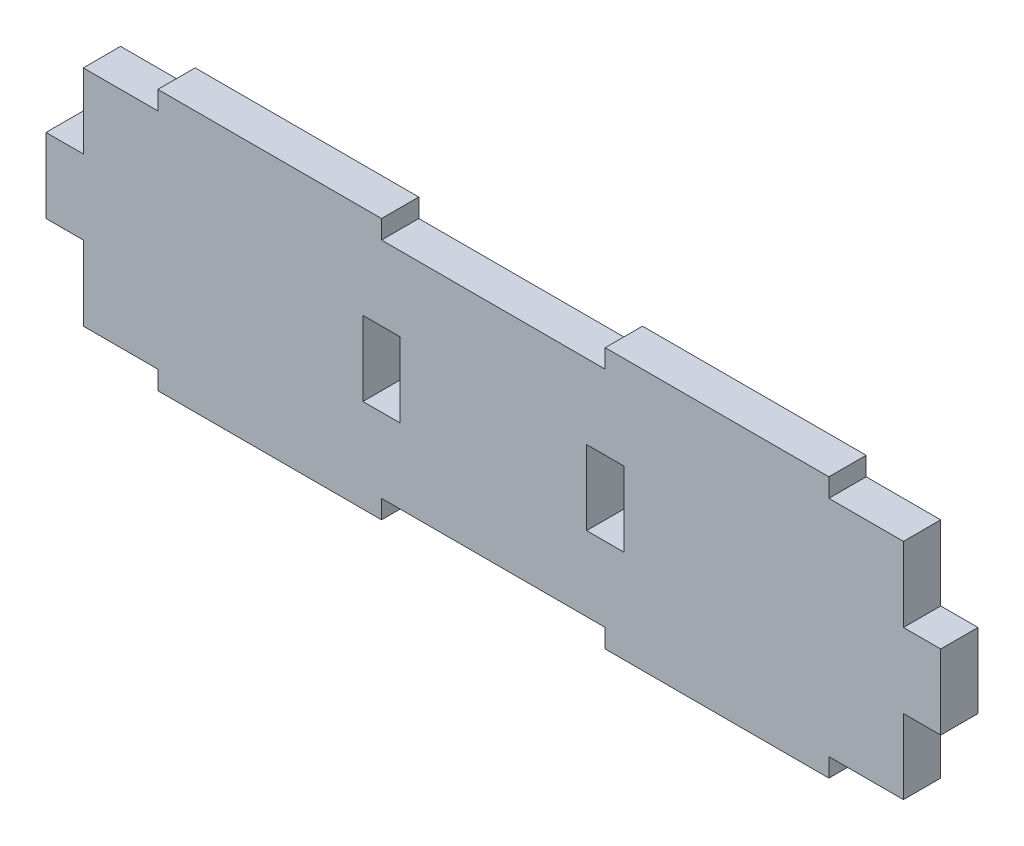
ISO-10303-21;
HEADER;
FILE_DESCRIPTION(('STEP AP214'),'2;1');
FILE_NAME('part.step','',(''),(''),'','','');
FILE_SCHEMA(('AUTOMOTIVE_DESIGN { 1 0 10303 214 1 1 1 1 }'));
ENDSEC;
DATA;
#1=APPLICATION_CONTEXT('core data for automotive mechanical design processes');
#2=APPLICATION_PROTOCOL_DEFINITION('international standard','automotive_design',2000,#1);
#3=PRODUCT_CONTEXT('',#1,'mechanical');
#4=PRODUCT('Part','Part','',(#3));
#5=PRODUCT_RELATED_PRODUCT_CATEGORY('part','',(#4));
#6=PRODUCT_DEFINITION_FORMATION('','',#4);
#7=PRODUCT_DEFINITION_CONTEXT('part definition',#1,'design');
#8=PRODUCT_DEFINITION('design','',#6,#7);
#9=PRODUCT_DEFINITION_SHAPE('','',#8);
#10=(LENGTH_UNIT() NAMED_UNIT(*) SI_UNIT(.MILLI.,.METRE.));
#11=(NAMED_UNIT(*) PLANE_ANGLE_UNIT() SI_UNIT($,.RADIAN.));
#12=(NAMED_UNIT(*) SI_UNIT($,.STERADIAN.) SOLID_ANGLE_UNIT());
#13=UNCERTAINTY_MEASURE_WITH_UNIT(LENGTH_MEASURE(1.E-05),#10,'distance_accuracy_value','');
#14=(GEOMETRIC_REPRESENTATION_CONTEXT(3) GLOBAL_UNCERTAINTY_ASSIGNED_CONTEXT((#13)) GLOBAL_UNIT_ASSIGNED_CONTEXT((#10,
#11,#12)) REPRESENTATION_CONTEXT('',''));
#15=CARTESIAN_POINT('',(0.,0.,0.));
#16=DIRECTION('',(0.,0.,1.));
#17=DIRECTION('',(1.,0.,0.));
#18=AXIS2_PLACEMENT_3D('',#15,#16,#17);
#19=CARTESIAN_POINT('',(0.,38.1,12.7));
#20=DIRECTION('',(0.,1.,0.));
#21=DIRECTION('',(0.,0.,1.));
#22=AXIS2_PLACEMENT_3D('',#19,#20,#21);
#23=PLANE('',#22);
#24=DIRECTION('',(0.,0.,1.));
#25=VECTOR('',#24,1.);
#26=CARTESIAN_POINT('',(-38.1,38.1,0.));
#27=LINE('',#26,#25);
#28=CARTESIAN_POINT('',(-38.1,38.1,0.));
#29=VERTEX_POINT('',#28);
#30=CARTESIAN_POINT('',(-38.1,38.1,12.7));
#31=VERTEX_POINT('',#30);
#32=EDGE_CURVE('E495',#29,#31,#27,.T.);
#33=ORIENTED_EDGE('',*,*,#32,.T.);
#34=DIRECTION('',(1.,0.,0.));
#35=VECTOR('',#34,1.);
#36=CARTESIAN_POINT('',(0.,38.1,12.7));
#37=LINE('',#36,#35);
#38=CARTESIAN_POINT('',(38.1,38.1,12.7));
#39=VERTEX_POINT('',#38);
#40=EDGE_CURVE('E631',#31,#39,#37,.T.);
#41=ORIENTED_EDGE('',*,*,#40,.T.);
#42=DIRECTION('',(0.,0.,1.));
#43=VECTOR('',#42,1.);
#44=CARTESIAN_POINT('',(38.1,38.1,0.));
#45=LINE('',#44,#43);
#46=CARTESIAN_POINT('',(38.1,38.1,0.));
#47=VERTEX_POINT('',#46);
#48=EDGE_CURVE('E533',#47,#39,#45,.T.);
#49=ORIENTED_EDGE('',*,*,#48,.F.);
#50=DIRECTION('',(1.,0.,0.));
#51=VECTOR('',#50,1.);
#52=CARTESIAN_POINT('',(0.,38.1,0.));
#53=LINE('',#52,#51);
#54=EDGE_CURVE('E643',#29,#47,#53,.T.);
#55=ORIENTED_EDGE('',*,*,#54,.F.);
#56=EDGE_LOOP('',(#33,#41,#49,#55));
#57=FACE_BOUND('',#56,.T.);
#58=ADVANCED_FACE('F41',(#57),#23,.T.);
#59=DIRECTION('',(0.,0.,1.));
#60=VECTOR('',#59,1.);
#61=CARTESIAN_POINT('',(139.7,38.1,0.));
#62=LINE('',#61,#60);
#63=CARTESIAN_POINT('',(139.7,38.1,0.));
#64=VERTEX_POINT('',#63);
#65=CARTESIAN_POINT('',(139.7,38.1,12.7));
#66=VERTEX_POINT('',#65);
#67=EDGE_CURVE('E432',#64,#66,#62,.T.);
#68=ORIENTED_EDGE('',*,*,#67,.F.);
#69=CARTESIAN_POINT('',(114.3,38.1,0.));
#70=VERTEX_POINT('',#69);
#71=EDGE_CURVE('E640',#70,#64,#53,.T.);
#72=ORIENTED_EDGE('',*,*,#71,.F.);
#73=DIRECTION('',(0.,0.,1.));
#74=VECTOR('',#73,1.);
#75=CARTESIAN_POINT('',(114.3,38.1,0.));
#76=LINE('',#75,#74);
#77=CARTESIAN_POINT('',(114.3,38.1,12.7));
#78=VERTEX_POINT('',#77);
#79=EDGE_CURVE('E522',#70,#78,#76,.T.);
#80=ORIENTED_EDGE('',*,*,#79,.T.);
#81=EDGE_CURVE('E629',#78,#66,#37,.T.);
#82=ORIENTED_EDGE('',*,*,#81,.T.);
#83=EDGE_LOOP('',(#68,#72,#80,#82));
#84=FACE_BOUND('',#83,.T.);
#85=ADVANCED_FACE('F656',(#84),#23,.T.);
#86=CARTESIAN_POINT('',(0.,-38.1,12.7));
#87=DIRECTION('',(0.,1.,0.));
#88=DIRECTION('',(0.,0.,1.));
#89=AXIS2_PLACEMENT_3D('',#86,#87,#88);
#90=PLANE('',#89);
#91=DIRECTION('',(1.,0.,0.));
#92=VECTOR('',#91,1.);
#93=CARTESIAN_POINT('',(0.,-38.1,0.));
#94=LINE('',#93,#92);
#95=CARTESIAN_POINT('',(-38.1,-38.1,0.));
#96=VERTEX_POINT('',#95);
#97=CARTESIAN_POINT('',(38.1,-38.1,0.));
#98=VERTEX_POINT('',#97);
#99=EDGE_CURVE('E637',#96,#98,#94,.T.);
#100=ORIENTED_EDGE('',*,*,#99,.T.);
#101=DIRECTION('',(0.,0.,1.));
#102=VECTOR('',#101,1.);
#103=CARTESIAN_POINT('',(38.1,-38.1,0.));
#104=LINE('',#103,#102);
#105=CARTESIAN_POINT('',(38.1,-38.1,12.7));
#106=VERTEX_POINT('',#105);
#107=EDGE_CURVE('E571',#98,#106,#104,.T.);
#108=ORIENTED_EDGE('',*,*,#107,.T.);
#109=DIRECTION('',(1.,0.,0.));
#110=VECTOR('',#109,1.);
#111=CARTESIAN_POINT('',(0.,-38.1,12.7));
#112=LINE('',#111,#110);
#113=CARTESIAN_POINT('',(-38.1,-38.1,12.7));
#114=VERTEX_POINT('',#113);
#115=EDGE_CURVE('E624',#114,#106,#112,.T.);
#116=ORIENTED_EDGE('',*,*,#115,.F.);
#117=DIRECTION('',(0.,0.,1.));
#118=VECTOR('',#117,1.);
#119=CARTESIAN_POINT('',(-38.1,-38.1,0.));
#120=LINE('',#119,#118);
#121=EDGE_CURVE('E596',#96,#114,#120,.T.);
#122=ORIENTED_EDGE('',*,*,#121,.F.);
#123=EDGE_LOOP('',(#100,#108,#116,#122));
#124=FACE_BOUND('',#123,.T.);
#125=ADVANCED_FACE('F709',(#124),#90,.F.);
#126=CARTESIAN_POINT('',(114.3,-38.1,0.));
#127=VERTEX_POINT('',#126);
#128=CARTESIAN_POINT('',(139.7,-38.1,0.));
#129=VERTEX_POINT('',#128);
#130=EDGE_CURVE('E610',#127,#129,#94,.T.);
#131=ORIENTED_EDGE('',*,*,#130,.T.);
#132=DIRECTION('',(0.,0.,1.));
#133=VECTOR('',#132,1.);
#134=CARTESIAN_POINT('',(139.7,-38.1,0.));
#135=LINE('',#134,#133);
#136=CARTESIAN_POINT('',(139.7,-38.1,12.7));
#137=VERTEX_POINT('',#136);
#138=EDGE_CURVE('E345',#129,#137,#135,.T.);
#139=ORIENTED_EDGE('',*,*,#138,.T.);
#140=CARTESIAN_POINT('',(114.3,-38.1,12.7));
#141=VERTEX_POINT('',#140);
#142=EDGE_CURVE('E625',#141,#137,#112,.T.);
#143=ORIENTED_EDGE('',*,*,#142,.F.);
#144=DIRECTION('',(0.,0.,1.));
#145=VECTOR('',#144,1.);
#146=CARTESIAN_POINT('',(114.3,-38.1,0.));
#147=LINE('',#146,#145);
#148=EDGE_CURVE('E575',#127,#141,#147,.T.);
#149=ORIENTED_EDGE('',*,*,#148,.F.);
#150=EDGE_LOOP('',(#131,#139,#143,#149));
#151=FACE_BOUND('',#150,.T.);
#152=ADVANCED_FACE('F684',(#151),#90,.F.);
#153=CARTESIAN_POINT('',(-139.7,-38.1,12.7));
#154=VERTEX_POINT('',#153);
#155=CARTESIAN_POINT('',(-114.3,-38.1,12.7));
#156=VERTEX_POINT('',#155);
#157=EDGE_CURVE('E620',#154,#156,#112,.T.);
#158=ORIENTED_EDGE('',*,*,#157,.F.);
#159=DIRECTION('',(0.,0.,1.));
#160=VECTOR('',#159,1.);
#161=CARTESIAN_POINT('',(-139.7,-38.1,0.));
#162=LINE('',#161,#160);
#163=CARTESIAN_POINT('',(-139.7,-38.1,0.));
#164=VERTEX_POINT('',#163);
#165=EDGE_CURVE('E455',#164,#154,#162,.T.);
#166=ORIENTED_EDGE('',*,*,#165,.F.);
#167=CARTESIAN_POINT('',(-114.3,-38.1,0.));
#168=VERTEX_POINT('',#167);
#169=EDGE_CURVE('E633',#164,#168,#94,.T.);
#170=ORIENTED_EDGE('',*,*,#169,.T.);
#171=DIRECTION('',(0.,0.,1.));
#172=VECTOR('',#171,1.);
#173=CARTESIAN_POINT('',(-114.3,-38.1,0.));
#174=LINE('',#173,#172);
#175=EDGE_CURVE('E614',#168,#156,#174,.T.);
#176=ORIENTED_EDGE('',*,*,#175,.T.);
#177=EDGE_LOOP('',(#158,#166,#170,#176));
#178=FACE_BOUND('',#177,.T.);
#179=ADVANCED_FACE('F43',(#178),#90,.F.);
#180=CARTESIAN_POINT('',(152.4,0.,12.7));
#181=DIRECTION('',(-1.,0.,0.));
#182=DIRECTION('',(0.,0.,1.));
#183=AXIS2_PLACEMENT_3D('',#180,#181,#182);
#184=PLANE('',#183);
#185=DIRECTION('',(0.,1.,0.));
#186=VECTOR('',#185,1.);
#187=CARTESIAN_POINT('',(152.4,0.,12.7));
#188=LINE('',#187,#186);
#189=CARTESIAN_POINT('',(152.4,-12.7,12.7));
#190=VERTEX_POINT('',#189);
#191=CARTESIAN_POINT('',(152.4,12.7,12.7));
#192=VERTEX_POINT('',#191);
#193=EDGE_CURVE('E623',#190,#192,#188,.T.);
#194=ORIENTED_EDGE('',*,*,#193,.F.);
#195=DIRECTION('',(0.,0.,1.));
#196=VECTOR('',#195,1.);
#197=CARTESIAN_POINT('',(152.4,-12.7,0.));
#198=LINE('',#197,#196);
#199=CARTESIAN_POINT('',(152.4,-12.7,0.));
#200=VERTEX_POINT('',#199);
#201=EDGE_CURVE('E337',#200,#190,#198,.T.);
#202=ORIENTED_EDGE('',*,*,#201,.F.);
#203=DIRECTION('',(0.,1.,0.));
#204=VECTOR('',#203,1.);
#205=CARTESIAN_POINT('',(152.4,0.,0.));
#206=LINE('',#205,#204);
#207=CARTESIAN_POINT('',(152.4,12.7,0.));
#208=VERTEX_POINT('',#207);
#209=EDGE_CURVE('E636',#200,#208,#206,.T.);
#210=ORIENTED_EDGE('',*,*,#209,.T.);
#211=DIRECTION('',(0.,0.,1.));
#212=VECTOR('',#211,1.);
#213=CARTESIAN_POINT('',(152.4,12.7,0.));
#214=LINE('',#213,#212);
#215=EDGE_CURVE('E410',#208,#192,#214,.T.);
#216=ORIENTED_EDGE('',*,*,#215,.T.);
#217=EDGE_LOOP('',(#194,#202,#210,#216));
#218=FACE_BOUND('',#217,.T.);
#219=ADVANCED_FACE('F673',(#218),#184,.F.);
#220=DIRECTION('',(0.,0.,1.));
#221=VECTOR('',#220,1.);
#222=CARTESIAN_POINT('',(-139.7,38.1,0.));
#223=LINE('',#222,#221);
#224=CARTESIAN_POINT('',(-139.7,38.1,0.));
#225=VERTEX_POINT('',#224);
#226=CARTESIAN_POINT('',(-139.7,38.1,12.7));
#227=VERTEX_POINT('',#226);
#228=EDGE_CURVE('E413',#225,#227,#223,.T.);
#229=ORIENTED_EDGE('',*,*,#228,.T.);
#230=CARTESIAN_POINT('',(-114.3,38.1,12.7));
#231=VERTEX_POINT('',#230);
#232=EDGE_CURVE('E51',#227,#231,#37,.T.);
#233=ORIENTED_EDGE('',*,*,#232,.T.);
#234=DIRECTION('',(0.,0.,1.));
#235=VECTOR('',#234,1.);
#236=CARTESIAN_POINT('',(-114.3,38.1,0.));
#237=LINE('',#236,#235);
#238=CARTESIAN_POINT('',(-114.3,38.1,0.));
#239=VERTEX_POINT('',#238);
#240=EDGE_CURVE('E500',#239,#231,#237,.T.);
#241=ORIENTED_EDGE('',*,*,#240,.F.);
#242=EDGE_CURVE('E641',#225,#239,#53,.T.);
#243=ORIENTED_EDGE('',*,*,#242,.F.);
#244=EDGE_LOOP('',(#229,#233,#241,#243));
#245=FACE_BOUND('',#244,.T.);
#246=ADVANCED_FACE('F746',(#245),#23,.T.);
#247=CARTESIAN_POINT('',(-152.4,0.,12.7));
#248=DIRECTION('',(-1.,0.,0.));
#249=DIRECTION('',(0.,0.,1.));
#250=AXIS2_PLACEMENT_3D('',#247,#248,#249);
#251=PLANE('',#250);
#252=DIRECTION('',(0.,0.,1.));
#253=VECTOR('',#252,1.);
#254=CARTESIAN_POINT('',(-152.4,12.7,0.));
#255=LINE('',#254,#253);
#256=CARTESIAN_POINT('',(-152.4,12.7,0.));
#257=VERTEX_POINT('',#256);
#258=CARTESIAN_POINT('',(-152.4,12.7,12.7));
#259=VERTEX_POINT('',#258);
#260=EDGE_CURVE('E405',#257,#259,#255,.T.);
#261=ORIENTED_EDGE('',*,*,#260,.F.);
#262=DIRECTION('',(0.,1.,0.));
#263=VECTOR('',#262,1.);
#264=CARTESIAN_POINT('',(-152.4,0.,0.));
#265=LINE('',#264,#263);
#266=CARTESIAN_POINT('',(-152.4,-12.7,0.));
#267=VERTEX_POINT('',#266);
#268=EDGE_CURVE('E45',#267,#257,#265,.T.);
#269=ORIENTED_EDGE('',*,*,#268,.F.);
#270=DIRECTION('',(0.,0.,1.));
#271=VECTOR('',#270,1.);
#272=CARTESIAN_POINT('',(-152.4,-12.7,0.));
#273=LINE('',#272,#271);
#274=CARTESIAN_POINT('',(-152.4,-12.7,12.7));
#275=VERTEX_POINT('',#274);
#276=EDGE_CURVE('E461',#267,#275,#273,.T.);
#277=ORIENTED_EDGE('',*,*,#276,.T.);
#278=DIRECTION('',(0.,1.,0.));
#279=VECTOR('',#278,1.);
#280=CARTESIAN_POINT('',(-152.4,0.,12.7));
#281=LINE('',#280,#279);
#282=EDGE_CURVE('E11',#275,#259,#281,.T.);
#283=ORIENTED_EDGE('',*,*,#282,.T.);
#284=EDGE_LOOP('',(#261,#269,#277,#283));
#285=FACE_BOUND('',#284,.T.);
#286=ADVANCED_FACE('F737',(#285),#251,.T.);
#287=CARTESIAN_POINT('',(0.,0.,12.7));
#288=DIRECTION('',(0.,0.,1.));
#289=DIRECTION('',(1.,0.,0.));
#290=AXIS2_PLACEMENT_3D('',#287,#288,#289);
#291=PLANE('',#290);
#292=DIRECTION('',(0.,-1.,0.));
#293=VECTOR('',#292,1.);
#294=CARTESIAN_POINT('',(31.75,12.7,12.7));
#295=LINE('',#294,#293);
#296=CARTESIAN_POINT('',(31.75,12.7,12.7));
#297=VERTEX_POINT('',#296);
#298=CARTESIAN_POINT('',(31.75,-12.7,12.7));
#299=VERTEX_POINT('',#298);
#300=EDGE_CURVE('E59',#297,#299,#295,.T.);
#301=ORIENTED_EDGE('',*,*,#300,.F.);
#302=DIRECTION('',(-1.,0.,0.));
#303=VECTOR('',#302,1.);
#304=CARTESIAN_POINT('',(31.75,12.7,12.7));
#305=LINE('',#304,#303);
#306=CARTESIAN_POINT('',(44.45,12.7,12.7));
#307=VERTEX_POINT('',#306);
#308=EDGE_CURVE('E360',#307,#297,#305,.T.);
#309=ORIENTED_EDGE('',*,*,#308,.F.);
#310=DIRECTION('',(0.,1.,0.));
#311=VECTOR('',#310,1.);
#312=CARTESIAN_POINT('',(44.45,12.7,12.7));
#313=LINE('',#312,#311);
#314=CARTESIAN_POINT('',(44.45,-12.7,12.7));
#315=VERTEX_POINT('',#314);
#316=EDGE_CURVE('E379',#315,#307,#313,.T.);
#317=ORIENTED_EDGE('',*,*,#316,.F.);
#318=DIRECTION('',(1.,0.,0.));
#319=VECTOR('',#318,1.);
#320=CARTESIAN_POINT('',(31.75,-12.7,12.7));
#321=LINE('',#320,#319);
#322=EDGE_CURVE('E375',#299,#315,#321,.T.);
#323=ORIENTED_EDGE('',*,*,#322,.F.);
#324=EDGE_LOOP('',(#301,#309,#317,#323));
#325=FACE_BOUND('',#324,.T.);
#326=DIRECTION('',(0.,-1.,0.));
#327=VECTOR('',#326,1.);
#328=CARTESIAN_POINT('',(139.7,-38.1,12.7));
#329=LINE('',#328,#327);
#330=CARTESIAN_POINT('',(139.7,-12.7,12.7));
#331=VERTEX_POINT('',#330);
#332=EDGE_CURVE('E333',#331,#137,#329,.T.);
#333=ORIENTED_EDGE('',*,*,#332,.F.);
#334=DIRECTION('',(-1.,0.,0.));
#335=VECTOR('',#334,1.);
#336=CARTESIAN_POINT('',(152.4,-12.7,12.7));
#337=LINE('',#336,#335);
#338=EDGE_CURVE('E338',#190,#331,#337,.T.);
#339=ORIENTED_EDGE('',*,*,#338,.F.);
#340=ORIENTED_EDGE('',*,*,#193,.T.);
#341=DIRECTION('',(1.,0.,0.));
#342=VECTOR('',#341,1.);
#343=CARTESIAN_POINT('',(152.4,12.7,12.7));
#344=LINE('',#343,#342);
#345=CARTESIAN_POINT('',(139.7,12.7,12.7));
#346=VERTEX_POINT('',#345);
#347=EDGE_CURVE('E428',#346,#192,#344,.T.);
#348=ORIENTED_EDGE('',*,*,#347,.F.);
#349=DIRECTION('',(0.,-1.,0.));
#350=VECTOR('',#349,1.);
#351=CARTESIAN_POINT('',(139.7,38.1,12.7));
#352=LINE('',#351,#350);
#353=EDGE_CURVE('E349',#66,#346,#352,.T.);
#354=ORIENTED_EDGE('',*,*,#353,.F.);
#355=ORIENTED_EDGE('',*,*,#81,.F.);
#356=DIRECTION('',(0.,1.,0.));
#357=VECTOR('',#356,1.);
#358=CARTESIAN_POINT('',(114.3,38.1,12.7));
#359=LINE('',#358,#357);
#360=CARTESIAN_POINT('',(114.3,44.45,12.7));
#361=VERTEX_POINT('',#360);
#362=EDGE_CURVE('E499',#78,#361,#359,.T.);
#363=ORIENTED_EDGE('',*,*,#362,.T.);
#364=DIRECTION('',(-1.,0.,0.));
#365=VECTOR('',#364,1.);
#366=CARTESIAN_POINT('',(38.1,44.45,12.7));
#367=LINE('',#366,#365);
#368=CARTESIAN_POINT('',(38.1,44.45,12.7));
#369=VERTEX_POINT('',#368);
#370=EDGE_CURVE('E526',#361,#369,#367,.T.);
#371=ORIENTED_EDGE('',*,*,#370,.T.);
#372=DIRECTION('',(0.,-1.,0.));
#373=VECTOR('',#372,1.);
#374=CARTESIAN_POINT('',(38.1,38.1,12.7));
#375=LINE('',#374,#373);
#376=EDGE_CURVE('E514',#369,#39,#375,.T.);
#377=ORIENTED_EDGE('',*,*,#376,.T.);
#378=ORIENTED_EDGE('',*,*,#40,.F.);
#379=DIRECTION('',(0.,1.,0.));
#380=VECTOR('',#379,1.);
#381=CARTESIAN_POINT('',(-38.1,38.1,12.7));
#382=LINE('',#381,#380);
#383=CARTESIAN_POINT('',(-38.1,44.45,12.7));
#384=VERTEX_POINT('',#383);
#385=EDGE_CURVE('E465',#31,#384,#382,.T.);
#386=ORIENTED_EDGE('',*,*,#385,.T.);
#387=DIRECTION('',(-1.,0.,0.));
#388=VECTOR('',#387,1.);
#389=CARTESIAN_POINT('',(-38.1,44.45,12.7));
#390=LINE('',#389,#388);
#391=CARTESIAN_POINT('',(-114.3,44.45,12.7));
#392=VERTEX_POINT('',#391);
#393=EDGE_CURVE('E488',#384,#392,#390,.T.);
#394=ORIENTED_EDGE('',*,*,#393,.T.);
#395=DIRECTION('',(0.,-1.,0.));
#396=VECTOR('',#395,1.);
#397=CARTESIAN_POINT('',(-114.3,38.1,12.7));
#398=LINE('',#397,#396);
#399=EDGE_CURVE('E476',#392,#231,#398,.T.);
#400=ORIENTED_EDGE('',*,*,#399,.T.);
#401=ORIENTED_EDGE('',*,*,#232,.F.);
#402=DIRECTION('',(0.,1.,0.));
#403=VECTOR('',#402,1.);
#404=CARTESIAN_POINT('',(-139.7,38.1,12.7));
#405=LINE('',#404,#403);
#406=CARTESIAN_POINT('',(-139.7,12.7,12.7));
#407=VERTEX_POINT('',#406);
#408=EDGE_CURVE('E401',#407,#227,#405,.T.);
#409=ORIENTED_EDGE('',*,*,#408,.F.);
#410=DIRECTION('',(1.,0.,0.));
#411=VECTOR('',#410,1.);
#412=CARTESIAN_POINT('',(-152.4,12.7,12.7));
#413=LINE('',#412,#411);
#414=EDGE_CURVE('E406',#259,#407,#413,.T.);
#415=ORIENTED_EDGE('',*,*,#414,.F.);
#416=ORIENTED_EDGE('',*,*,#282,.F.);
#417=DIRECTION('',(-1.,0.,0.));
#418=VECTOR('',#417,1.);
#419=CARTESIAN_POINT('',(-152.4,-12.7,12.7));
#420=LINE('',#419,#418);
#421=CARTESIAN_POINT('',(-139.7,-12.7,12.7));
#422=VERTEX_POINT('',#421);
#423=EDGE_CURVE('E451',#422,#275,#420,.T.);
#424=ORIENTED_EDGE('',*,*,#423,.F.);
#425=DIRECTION('',(0.,1.,0.));
#426=VECTOR('',#425,1.);
#427=CARTESIAN_POINT('',(-139.7,-38.1,12.7));
#428=LINE('',#427,#426);
#429=EDGE_CURVE('E417',#154,#422,#428,.T.);
#430=ORIENTED_EDGE('',*,*,#429,.F.);
#431=ORIENTED_EDGE('',*,*,#157,.T.);
#432=DIRECTION('',(0.,-1.,0.));
#433=VECTOR('',#432,1.);
#434=CARTESIAN_POINT('',(-114.3,-38.1,12.7));
#435=LINE('',#434,#433);
#436=CARTESIAN_POINT('',(-114.3,-44.45,12.7));
#437=VERTEX_POINT('',#436);
#438=EDGE_CURVE('E600',#156,#437,#435,.T.);
#439=ORIENTED_EDGE('',*,*,#438,.T.);
#440=DIRECTION('',(1.,0.,0.));
#441=VECTOR('',#440,1.);
#442=CARTESIAN_POINT('',(-38.1,-44.45,12.7));
#443=LINE('',#442,#441);
#444=CARTESIAN_POINT('',(-38.1,-44.45,12.7));
#445=VERTEX_POINT('',#444);
#446=EDGE_CURVE('E588',#437,#445,#443,.T.);
#447=ORIENTED_EDGE('',*,*,#446,.T.);
#448=DIRECTION('',(0.,1.,0.));
#449=VECTOR('',#448,1.);
#450=CARTESIAN_POINT('',(-38.1,-38.1,12.7));
#451=LINE('',#450,#449);
#452=EDGE_CURVE('E574',#445,#114,#451,.T.);
#453=ORIENTED_EDGE('',*,*,#452,.T.);
#454=ORIENTED_EDGE('',*,*,#115,.T.);
#455=DIRECTION('',(0.,-1.,0.));
#456=VECTOR('',#455,1.);
#457=CARTESIAN_POINT('',(38.1,-38.1,12.7));
#458=LINE('',#457,#456);
#459=CARTESIAN_POINT('',(38.1,-44.45,12.7));
#460=VERTEX_POINT('',#459);
#461=EDGE_CURVE('E537',#106,#460,#458,.T.);
#462=ORIENTED_EDGE('',*,*,#461,.T.);
#463=DIRECTION('',(1.,0.,0.));
#464=VECTOR('',#463,1.);
#465=CARTESIAN_POINT('',(38.1,-44.45,12.7));
#466=LINE('',#465,#464);
#467=CARTESIAN_POINT('',(114.3,-44.45,12.7));
#468=VERTEX_POINT('',#467);
#469=EDGE_CURVE('E564',#460,#468,#466,.T.);
#470=ORIENTED_EDGE('',*,*,#469,.T.);
#471=DIRECTION('',(0.,1.,0.));
#472=VECTOR('',#471,1.);
#473=CARTESIAN_POINT('',(114.3,-38.1,12.7));
#474=LINE('',#473,#472);
#475=EDGE_CURVE('E552',#468,#141,#474,.T.);
#476=ORIENTED_EDGE('',*,*,#475,.T.);
#477=ORIENTED_EDGE('',*,*,#142,.T.);
#478=EDGE_LOOP('',(#333,#339,#340,#348,#354,#355,#363,#371,#377,#378,#386,#394,#400,#401,#409,
#415,#416,#424,#430,#431,#439,#447,#453,#454,#462,#470,#476,#477));
#479=FACE_BOUND('',#478,.T.);
#480=DIRECTION('',(0.,1.,0.));
#481=VECTOR('',#480,1.);
#482=CARTESIAN_POINT('',(-31.75,12.7,12.7));
#483=LINE('',#482,#481);
#484=CARTESIAN_POINT('',(-31.75,-12.7,12.7));
#485=VERTEX_POINT('',#484);
#486=CARTESIAN_POINT('',(-31.75,12.7,12.7));
#487=VERTEX_POINT('',#486);
#488=EDGE_CURVE('E67',#485,#487,#483,.T.);
#489=ORIENTED_EDGE('',*,*,#488,.F.);
#490=DIRECTION('',(1.,0.,0.));
#491=VECTOR('',#490,1.);
#492=CARTESIAN_POINT('',(-31.75,-12.7,12.7));
#493=LINE('',#492,#491);
#494=CARTESIAN_POINT('',(-44.45,-12.7,12.7));
#495=VERTEX_POINT('',#494);
#496=EDGE_CURVE('E301',#495,#485,#493,.T.);
#497=ORIENTED_EDGE('',*,*,#496,.F.);
#498=DIRECTION('',(0.,-1.,0.));
#499=VECTOR('',#498,1.);
#500=CARTESIAN_POINT('',(-44.45,12.7,12.7));
#501=LINE('',#500,#499);
#502=CARTESIAN_POINT('',(-44.45,12.7,12.7));
#503=VERTEX_POINT('',#502);
#504=EDGE_CURVE('E305',#503,#495,#501,.T.);
#505=ORIENTED_EDGE('',*,*,#504,.F.);
#506=DIRECTION('',(-1.,0.,0.));
#507=VECTOR('',#506,1.);
#508=CARTESIAN_POINT('',(-31.75,12.7,12.7));
#509=LINE('',#508,#507);
#510=EDGE_CURVE('E314',#487,#503,#509,.T.);
#511=ORIENTED_EDGE('',*,*,#510,.F.);
#512=EDGE_LOOP('',(#489,#497,#505,#511));
#513=FACE_BOUND('',#512,.T.);
#514=ADVANCED_FACE('F666',(#325,#479,#513),#291,.T.);
#515=CARTESIAN_POINT('',(0.,0.,0.));
#516=DIRECTION('',(0.,0.,1.));
#517=DIRECTION('',(1.,0.,0.));
#518=AXIS2_PLACEMENT_3D('',#515,#516,#517);
#519=PLANE('',#518);
#520=DIRECTION('',(-1.,0.,0.));
#521=VECTOR('',#520,1.);
#522=CARTESIAN_POINT('',(31.75,12.7,0.));
#523=LINE('',#522,#521);
#524=CARTESIAN_POINT('',(44.45,12.7,0.));
#525=VERTEX_POINT('',#524);
#526=CARTESIAN_POINT('',(31.75,12.7,0.));
#527=VERTEX_POINT('',#526);
#528=EDGE_CURVE('E368',#525,#527,#523,.T.);
#529=ORIENTED_EDGE('',*,*,#528,.T.);
#530=DIRECTION('',(0.,-1.,0.));
#531=VECTOR('',#530,1.);
#532=CARTESIAN_POINT('',(31.75,12.7,0.));
#533=LINE('',#532,#531);
#534=CARTESIAN_POINT('',(31.75,-12.7,0.));
#535=VERTEX_POINT('',#534);
#536=EDGE_CURVE('E355',#527,#535,#533,.T.);
#537=ORIENTED_EDGE('',*,*,#536,.T.);
#538=DIRECTION('',(1.,0.,0.));
#539=VECTOR('',#538,1.);
#540=CARTESIAN_POINT('',(31.75,-12.7,0.));
#541=LINE('',#540,#539);
#542=CARTESIAN_POINT('',(44.45,-12.7,0.));
#543=VERTEX_POINT('',#542);
#544=EDGE_CURVE('E359',#535,#543,#541,.T.);
#545=ORIENTED_EDGE('',*,*,#544,.T.);
#546=DIRECTION('',(0.,1.,0.));
#547=VECTOR('',#546,1.);
#548=CARTESIAN_POINT('',(44.45,12.7,0.));
#549=LINE('',#548,#547);
#550=EDGE_CURVE('E364',#543,#525,#549,.T.);
#551=ORIENTED_EDGE('',*,*,#550,.T.);
#552=EDGE_LOOP('',(#529,#537,#545,#551));
#553=FACE_BOUND('',#552,.T.);
#554=DIRECTION('',(1.,0.,0.));
#555=VECTOR('',#554,1.);
#556=CARTESIAN_POINT('',(-31.75,-12.7,0.));
#557=LINE('',#556,#555);
#558=CARTESIAN_POINT('',(-44.45,-12.7,0.));
#559=VERTEX_POINT('',#558);
#560=CARTESIAN_POINT('',(-31.75,-12.7,0.));
#561=VERTEX_POINT('',#560);
#562=EDGE_CURVE('E286',#559,#561,#557,.T.);
#563=ORIENTED_EDGE('',*,*,#562,.T.);
#564=DIRECTION('',(0.,1.,0.));
#565=VECTOR('',#564,1.);
#566=CARTESIAN_POINT('',(-31.75,12.7,0.));
#567=LINE('',#566,#565);
#568=CARTESIAN_POINT('',(-31.75,12.7,0.));
#569=VERTEX_POINT('',#568);
#570=EDGE_CURVE('E279',#561,#569,#567,.T.);
#571=ORIENTED_EDGE('',*,*,#570,.T.);
#572=DIRECTION('',(-1.,0.,0.));
#573=VECTOR('',#572,1.);
#574=CARTESIAN_POINT('',(-31.75,12.7,0.));
#575=LINE('',#574,#573);
#576=CARTESIAN_POINT('',(-44.45,12.7,0.));
#577=VERTEX_POINT('',#576);
#578=EDGE_CURVE('E290',#569,#577,#575,.T.);
#579=ORIENTED_EDGE('',*,*,#578,.T.);
#580=DIRECTION('',(0.,-1.,0.));
#581=VECTOR('',#580,1.);
#582=CARTESIAN_POINT('',(-44.45,12.7,0.));
#583=LINE('',#582,#581);
#584=EDGE_CURVE('E295',#577,#559,#583,.T.);
#585=ORIENTED_EDGE('',*,*,#584,.T.);
#586=EDGE_LOOP('',(#563,#571,#579,#585));
#587=FACE_BOUND('',#586,.T.);
#588=DIRECTION('',(-1.,0.,0.));
#589=VECTOR('',#588,1.);
#590=CARTESIAN_POINT('',(152.4,-12.7,0.));
#591=LINE('',#590,#589);
#592=CARTESIAN_POINT('',(139.7,-12.7,0.));
#593=VERTEX_POINT('',#592);
#594=EDGE_CURVE('E328',#200,#593,#591,.T.);
#595=ORIENTED_EDGE('',*,*,#594,.T.);
#596=DIRECTION('',(0.,-1.,0.));
#597=VECTOR('',#596,1.);
#598=CARTESIAN_POINT('',(139.7,-38.1,0.));
#599=LINE('',#598,#597);
#600=EDGE_CURVE('E332',#593,#129,#599,.T.);
#601=ORIENTED_EDGE('',*,*,#600,.T.);
#602=ORIENTED_EDGE('',*,*,#130,.F.);
#603=DIRECTION('',(0.,1.,0.));
#604=VECTOR('',#603,1.);
#605=CARTESIAN_POINT('',(114.3,-38.1,0.));
#606=LINE('',#605,#604);
#607=CARTESIAN_POINT('',(114.3,-44.45,0.));
#608=VERTEX_POINT('',#607);
#609=EDGE_CURVE('E556',#608,#127,#606,.T.);
#610=ORIENTED_EDGE('',*,*,#609,.F.);
#611=DIRECTION('',(1.,0.,0.));
#612=VECTOR('',#611,1.);
#613=CARTESIAN_POINT('',(38.1,-44.45,0.));
#614=LINE('',#613,#612);
#615=CARTESIAN_POINT('',(38.1,-44.45,0.));
#616=VERTEX_POINT('',#615);
#617=EDGE_CURVE('E551',#616,#608,#614,.T.);
#618=ORIENTED_EDGE('',*,*,#617,.F.);
#619=DIRECTION('',(0.,-1.,0.));
#620=VECTOR('',#619,1.);
#621=CARTESIAN_POINT('',(38.1,-38.1,0.));
#622=LINE('',#621,#620);
#623=EDGE_CURVE('E547',#98,#616,#622,.T.);
#624=ORIENTED_EDGE('',*,*,#623,.F.);
#625=ORIENTED_EDGE('',*,*,#99,.F.);
#626=DIRECTION('',(0.,1.,0.));
#627=VECTOR('',#626,1.);
#628=CARTESIAN_POINT('',(-38.1,-38.1,0.));
#629=LINE('',#628,#627);
#630=CARTESIAN_POINT('',(-38.1,-44.45,0.));
#631=VERTEX_POINT('',#630);
#632=EDGE_CURVE('E584',#631,#96,#629,.T.);
#633=ORIENTED_EDGE('',*,*,#632,.F.);
#634=DIRECTION('',(1.,0.,0.));
#635=VECTOR('',#634,1.);
#636=CARTESIAN_POINT('',(-38.1,-44.45,0.));
#637=LINE('',#636,#635);
#638=CARTESIAN_POINT('',(-114.3,-44.45,0.));
#639=VERTEX_POINT('',#638);
#640=EDGE_CURVE('E592',#639,#631,#637,.T.);
#641=ORIENTED_EDGE('',*,*,#640,.F.);
#642=DIRECTION('',(0.,-1.,0.));
#643=VECTOR('',#642,1.);
#644=CARTESIAN_POINT('',(-114.3,-38.1,0.));
#645=LINE('',#644,#643);
#646=EDGE_CURVE('E587',#168,#639,#645,.T.);
#647=ORIENTED_EDGE('',*,*,#646,.F.);
#648=ORIENTED_EDGE('',*,*,#169,.F.);
#649=DIRECTION('',(0.,1.,0.));
#650=VECTOR('',#649,1.);
#651=CARTESIAN_POINT('',(-139.7,-38.1,0.));
#652=LINE('',#651,#650);
#653=CARTESIAN_POINT('',(-139.7,-12.7,0.));
#654=VERTEX_POINT('',#653);
#655=EDGE_CURVE('E446',#164,#654,#652,.T.);
#656=ORIENTED_EDGE('',*,*,#655,.T.);
#657=DIRECTION('',(-1.,0.,0.));
#658=VECTOR('',#657,1.);
#659=CARTESIAN_POINT('',(-152.4,-12.7,0.));
#660=LINE('',#659,#658);
#661=EDGE_CURVE('E450',#654,#267,#660,.T.);
#662=ORIENTED_EDGE('',*,*,#661,.T.);
#663=ORIENTED_EDGE('',*,*,#268,.T.);
#664=DIRECTION('',(1.,0.,0.));
#665=VECTOR('',#664,1.);
#666=CARTESIAN_POINT('',(-152.4,12.7,0.));
#667=LINE('',#666,#665);
#668=CARTESIAN_POINT('',(-139.7,12.7,0.));
#669=VERTEX_POINT('',#668);
#670=EDGE_CURVE('E396',#257,#669,#667,.T.);
#671=ORIENTED_EDGE('',*,*,#670,.T.);
#672=DIRECTION('',(0.,1.,0.));
#673=VECTOR('',#672,1.);
#674=CARTESIAN_POINT('',(-139.7,38.1,0.));
#675=LINE('',#674,#673);
#676=EDGE_CURVE('E400',#669,#225,#675,.T.);
#677=ORIENTED_EDGE('',*,*,#676,.T.);
#678=ORIENTED_EDGE('',*,*,#242,.T.);
#679=DIRECTION('',(0.,-1.,0.));
#680=VECTOR('',#679,1.);
#681=CARTESIAN_POINT('',(-114.3,38.1,0.));
#682=LINE('',#681,#680);
#683=CARTESIAN_POINT('',(-114.3,44.45,0.));
#684=VERTEX_POINT('',#683);
#685=EDGE_CURVE('E480',#684,#239,#682,.T.);
#686=ORIENTED_EDGE('',*,*,#685,.F.);
#687=DIRECTION('',(-1.,0.,0.));
#688=VECTOR('',#687,1.);
#689=CARTESIAN_POINT('',(-38.1,44.45,0.));
#690=LINE('',#689,#688);
#691=CARTESIAN_POINT('',(-38.1,44.45,0.));
#692=VERTEX_POINT('',#691);
#693=EDGE_CURVE('E475',#692,#684,#690,.T.);
#694=ORIENTED_EDGE('',*,*,#693,.F.);
#695=DIRECTION('',(0.,1.,0.));
#696=VECTOR('',#695,1.);
#697=CARTESIAN_POINT('',(-38.1,38.1,0.));
#698=LINE('',#697,#696);
#699=EDGE_CURVE('E471',#29,#692,#698,.T.);
#700=ORIENTED_EDGE('',*,*,#699,.F.);
#701=ORIENTED_EDGE('',*,*,#54,.T.);
#702=DIRECTION('',(0.,-1.,0.));
#703=VECTOR('',#702,1.);
#704=CARTESIAN_POINT('',(38.1,38.1,0.));
#705=LINE('',#704,#703);
#706=CARTESIAN_POINT('',(38.1,44.45,0.));
#707=VERTEX_POINT('',#706);
#708=EDGE_CURVE('E518',#707,#47,#705,.T.);
#709=ORIENTED_EDGE('',*,*,#708,.F.);
#710=DIRECTION('',(-1.,0.,0.));
#711=VECTOR('',#710,1.);
#712=CARTESIAN_POINT('',(38.1,44.45,0.));
#713=LINE('',#712,#711);
#714=CARTESIAN_POINT('',(114.3,44.45,0.));
#715=VERTEX_POINT('',#714);
#716=EDGE_CURVE('E513',#715,#707,#713,.T.);
#717=ORIENTED_EDGE('',*,*,#716,.F.);
#718=DIRECTION('',(0.,1.,0.));
#719=VECTOR('',#718,1.);
#720=CARTESIAN_POINT('',(114.3,38.1,0.));
#721=LINE('',#720,#719);
#722=EDGE_CURVE('E509',#70,#715,#721,.T.);
#723=ORIENTED_EDGE('',*,*,#722,.F.);
#724=ORIENTED_EDGE('',*,*,#71,.T.);
#725=DIRECTION('',(0.,-1.,0.));
#726=VECTOR('',#725,1.);
#727=CARTESIAN_POINT('',(139.7,38.1,0.));
#728=LINE('',#727,#726);
#729=CARTESIAN_POINT('',(139.7,12.7,0.));
#730=VERTEX_POINT('',#729);
#731=EDGE_CURVE('E423',#64,#730,#728,.T.);
#732=ORIENTED_EDGE('',*,*,#731,.T.);
#733=DIRECTION('',(1.,0.,0.));
#734=VECTOR('',#733,1.);
#735=CARTESIAN_POINT('',(152.4,12.7,0.));
#736=LINE('',#735,#734);
#737=EDGE_CURVE('E427',#730,#208,#736,.T.);
#738=ORIENTED_EDGE('',*,*,#737,.T.);
#739=ORIENTED_EDGE('',*,*,#209,.F.);
#740=EDGE_LOOP('',(#595,#601,#602,#610,#618,#624,#625,#633,#641,#647,#648,#656,#662,#663,#671,
#677,#678,#686,#694,#700,#701,#709,#717,#723,#724,#732,#738,#739));
#741=FACE_BOUND('',#740,.T.);
#742=ADVANCED_FACE('F297',(#553,#587,#741),#519,.F.);
#743=CARTESIAN_POINT('',(-38.1,-38.1,0.));
#744=DIRECTION('',(1.,0.,0.));
#745=DIRECTION('',(0.,0.,-1.));
#746=AXIS2_PLACEMENT_3D('',#743,#744,#745);
#747=PLANE('',#746);
#748=ORIENTED_EDGE('',*,*,#452,.F.);
#749=DIRECTION('',(0.,0.,1.));
#750=VECTOR('',#749,1.);
#751=CARTESIAN_POINT('',(-38.1,-44.45,0.));
#752=LINE('',#751,#750);
#753=EDGE_CURVE('E607',#631,#445,#752,.T.);
#754=ORIENTED_EDGE('',*,*,#753,.F.);
#755=ORIENTED_EDGE('',*,*,#632,.T.);
#756=ORIENTED_EDGE('',*,*,#121,.T.);
#757=EDGE_LOOP('',(#748,#754,#755,#756));
#758=FACE_BOUND('',#757,.T.);
#759=ADVANCED_FACE('F852',(#758),#747,.T.);
#760=CARTESIAN_POINT('',(-38.1,-44.45,0.));
#761=DIRECTION('',(0.,-1.,0.));
#762=DIRECTION('',(1.,0.,0.));
#763=AXIS2_PLACEMENT_3D('',#760,#761,#762);
#764=PLANE('',#763);
#765=ORIENTED_EDGE('',*,*,#446,.F.);
#766=DIRECTION('',(0.,0.,1.));
#767=VECTOR('',#766,1.);
#768=CARTESIAN_POINT('',(-114.3,-44.45,0.));
#769=LINE('',#768,#767);
#770=EDGE_CURVE('E611',#639,#437,#769,.T.);
#771=ORIENTED_EDGE('',*,*,#770,.F.);
#772=ORIENTED_EDGE('',*,*,#640,.T.);
#773=ORIENTED_EDGE('',*,*,#753,.T.);
#774=EDGE_LOOP('',(#765,#771,#772,#773));
#775=FACE_BOUND('',#774,.T.);
#776=ADVANCED_FACE('F716',(#775),#764,.T.);
#777=CARTESIAN_POINT('',(-114.3,-38.1,0.));
#778=DIRECTION('',(-1.,0.,0.));
#779=DIRECTION('',(0.,0.,1.));
#780=AXIS2_PLACEMENT_3D('',#777,#778,#779);
#781=PLANE('',#780);
#782=ORIENTED_EDGE('',*,*,#438,.F.);
#783=ORIENTED_EDGE('',*,*,#175,.F.);
#784=ORIENTED_EDGE('',*,*,#646,.T.);
#785=ORIENTED_EDGE('',*,*,#770,.T.);
#786=EDGE_LOOP('',(#782,#783,#784,#785));
#787=FACE_BOUND('',#786,.T.);
#788=ADVANCED_FACE('F720',(#787),#781,.T.);
#789=CARTESIAN_POINT('',(38.1,-38.1,0.));
#790=DIRECTION('',(-1.,0.,0.));
#791=DIRECTION('',(0.,0.,1.));
#792=AXIS2_PLACEMENT_3D('',#789,#790,#791);
#793=PLANE('',#792);
#794=ORIENTED_EDGE('',*,*,#461,.F.);
#795=ORIENTED_EDGE('',*,*,#107,.F.);
#796=ORIENTED_EDGE('',*,*,#623,.T.);
#797=DIRECTION('',(0.,0.,1.));
#798=VECTOR('',#797,1.);
#799=CARTESIAN_POINT('',(38.1,-44.45,0.));
#800=LINE('',#799,#798);
#801=EDGE_CURVE('E560',#616,#460,#800,.T.);
#802=ORIENTED_EDGE('',*,*,#801,.T.);
#803=EDGE_LOOP('',(#794,#795,#796,#802));
#804=FACE_BOUND('',#803,.T.);
#805=ADVANCED_FACE('F697',(#804),#793,.T.);
#806=CARTESIAN_POINT('',(114.3,-38.1,0.));
#807=DIRECTION('',(1.,0.,0.));
#808=DIRECTION('',(0.,0.,-1.));
#809=AXIS2_PLACEMENT_3D('',#806,#807,#808);
#810=PLANE('',#809);
#811=ORIENTED_EDGE('',*,*,#475,.F.);
#812=DIRECTION('',(0.,0.,1.));
#813=VECTOR('',#812,1.);
#814=CARTESIAN_POINT('',(114.3,-44.45,0.));
#815=LINE('',#814,#813);
#816=EDGE_CURVE('E579',#608,#468,#815,.T.);
#817=ORIENTED_EDGE('',*,*,#816,.F.);
#818=ORIENTED_EDGE('',*,*,#609,.T.);
#819=ORIENTED_EDGE('',*,*,#148,.T.);
#820=EDGE_LOOP('',(#811,#817,#818,#819));
#821=FACE_BOUND('',#820,.T.);
#822=ADVANCED_FACE('F705',(#821),#810,.T.);
#823=CARTESIAN_POINT('',(38.1,-44.45,0.));
#824=DIRECTION('',(0.,-1.,0.));
#825=DIRECTION('',(0.,0.,-1.));
#826=AXIS2_PLACEMENT_3D('',#823,#824,#825);
#827=PLANE('',#826);
#828=ORIENTED_EDGE('',*,*,#469,.F.);
#829=ORIENTED_EDGE('',*,*,#801,.F.);
#830=ORIENTED_EDGE('',*,*,#617,.T.);
#831=ORIENTED_EDGE('',*,*,#816,.T.);
#832=EDGE_LOOP('',(#828,#829,#830,#831));
#833=FACE_BOUND('',#832,.T.);
#834=ADVANCED_FACE('F702',(#833),#827,.T.);
#835=CARTESIAN_POINT('',(38.1,38.1,0.));
#836=DIRECTION('',(-1.,0.,0.));
#837=DIRECTION('',(0.,0.,1.));
#838=AXIS2_PLACEMENT_3D('',#835,#836,#837);
#839=PLANE('',#838);
#840=ORIENTED_EDGE('',*,*,#376,.F.);
#841=DIRECTION('',(0.,0.,1.));
#842=VECTOR('',#841,1.);
#843=CARTESIAN_POINT('',(38.1,44.45,0.));
#844=LINE('',#843,#842);
#845=EDGE_CURVE('E538',#707,#369,#844,.T.);
#846=ORIENTED_EDGE('',*,*,#845,.F.);
#847=ORIENTED_EDGE('',*,*,#708,.T.);
#848=ORIENTED_EDGE('',*,*,#48,.T.);
#849=EDGE_LOOP('',(#840,#846,#847,#848));
#850=FACE_BOUND('',#849,.T.);
#851=ADVANCED_FACE('F764',(#850),#839,.T.);
#852=CARTESIAN_POINT('',(38.1,44.45,0.));
#853=DIRECTION('',(0.,1.,0.));
#854=DIRECTION('',(-1.,0.,0.));
#855=AXIS2_PLACEMENT_3D('',#852,#853,#854);
#856=PLANE('',#855);
#857=ORIENTED_EDGE('',*,*,#370,.F.);
#858=DIRECTION('',(0.,0.,1.));
#859=VECTOR('',#858,1.);
#860=CARTESIAN_POINT('',(114.3,44.45,0.));
#861=LINE('',#860,#859);
#862=EDGE_CURVE('E541',#715,#361,#861,.T.);
#863=ORIENTED_EDGE('',*,*,#862,.F.);
#864=ORIENTED_EDGE('',*,*,#716,.T.);
#865=ORIENTED_EDGE('',*,*,#845,.T.);
#866=EDGE_LOOP('',(#857,#863,#864,#865));
#867=FACE_BOUND('',#866,.T.);
#868=ADVANCED_FACE('F770',(#867),#856,.T.);
#869=CARTESIAN_POINT('',(114.3,38.1,0.));
#870=DIRECTION('',(1.,0.,0.));
#871=DIRECTION('',(0.,0.,-1.));
#872=AXIS2_PLACEMENT_3D('',#869,#870,#871);
#873=PLANE('',#872);
#874=ORIENTED_EDGE('',*,*,#362,.F.);
#875=ORIENTED_EDGE('',*,*,#79,.F.);
#876=ORIENTED_EDGE('',*,*,#722,.T.);
#877=ORIENTED_EDGE('',*,*,#862,.T.);
#878=EDGE_LOOP('',(#874,#875,#876,#877));
#879=FACE_BOUND('',#878,.T.);
#880=ADVANCED_FACE('F772',(#879),#873,.T.);
#881=CARTESIAN_POINT('',(-38.1,38.1,0.));
#882=DIRECTION('',(1.,0.,0.));
#883=DIRECTION('',(0.,0.,-1.));
#884=AXIS2_PLACEMENT_3D('',#881,#882,#883);
#885=PLANE('',#884);
#886=ORIENTED_EDGE('',*,*,#385,.F.);
#887=ORIENTED_EDGE('',*,*,#32,.F.);
#888=ORIENTED_EDGE('',*,*,#699,.T.);
#889=DIRECTION('',(0.,0.,1.));
#890=VECTOR('',#889,1.);
#891=CARTESIAN_POINT('',(-38.1,44.45,0.));
#892=LINE('',#891,#890);
#893=EDGE_CURVE('E484',#692,#384,#892,.T.);
#894=ORIENTED_EDGE('',*,*,#893,.T.);
#895=EDGE_LOOP('',(#886,#887,#888,#894));
#896=FACE_BOUND('',#895,.T.);
#897=ADVANCED_FACE('F756',(#896),#885,.T.);
#898=CARTESIAN_POINT('',(-114.3,38.1,0.));
#899=DIRECTION('',(-1.,0.,0.));
#900=DIRECTION('',(0.,0.,1.));
#901=AXIS2_PLACEMENT_3D('',#898,#899,#900);
#902=PLANE('',#901);
#903=ORIENTED_EDGE('',*,*,#399,.F.);
#904=DIRECTION('',(0.,0.,1.));
#905=VECTOR('',#904,1.);
#906=CARTESIAN_POINT('',(-114.3,44.45,0.));
#907=LINE('',#906,#905);
#908=EDGE_CURVE('E504',#684,#392,#907,.T.);
#909=ORIENTED_EDGE('',*,*,#908,.F.);
#910=ORIENTED_EDGE('',*,*,#685,.T.);
#911=ORIENTED_EDGE('',*,*,#240,.T.);
#912=EDGE_LOOP('',(#903,#909,#910,#911));
#913=FACE_BOUND('',#912,.T.);
#914=ADVANCED_FACE('F751',(#913),#902,.T.);
#915=CARTESIAN_POINT('',(-38.1,44.45,0.));
#916=DIRECTION('',(0.,1.,0.));
#917=DIRECTION('',(-1.,0.,0.));
#918=AXIS2_PLACEMENT_3D('',#915,#916,#917);
#919=PLANE('',#918);
#920=ORIENTED_EDGE('',*,*,#393,.F.);
#921=ORIENTED_EDGE('',*,*,#893,.F.);
#922=ORIENTED_EDGE('',*,*,#693,.T.);
#923=ORIENTED_EDGE('',*,*,#908,.T.);
#924=EDGE_LOOP('',(#920,#921,#922,#923));
#925=FACE_BOUND('',#924,.T.);
#926=ADVANCED_FACE('F754',(#925),#919,.T.);
#927=CARTESIAN_POINT('',(-152.4,-12.7,0.));
#928=DIRECTION('',(0.,1.,0.));
#929=DIRECTION('',(0.,0.,1.));
#930=AXIS2_PLACEMENT_3D('',#927,#928,#929);
#931=PLANE('',#930);
#932=ORIENTED_EDGE('',*,*,#423,.T.);
#933=ORIENTED_EDGE('',*,*,#276,.F.);
#934=ORIENTED_EDGE('',*,*,#661,.F.);
#935=DIRECTION('',(0.,0.,1.));
#936=VECTOR('',#935,1.);
#937=CARTESIAN_POINT('',(-139.7,-12.7,0.));
#938=LINE('',#937,#936);
#939=EDGE_CURVE('E466',#654,#422,#938,.T.);
#940=ORIENTED_EDGE('',*,*,#939,.T.);
#941=EDGE_LOOP('',(#932,#933,#934,#940));
#942=FACE_BOUND('',#941,.T.);
#943=ADVANCED_FACE('F733',(#942),#931,.F.);
#944=CARTESIAN_POINT('',(-139.7,-38.1,0.));
#945=DIRECTION('',(1.,0.,0.));
#946=DIRECTION('',(0.,0.,-1.));
#947=AXIS2_PLACEMENT_3D('',#944,#945,#946);
#948=PLANE('',#947);
#949=ORIENTED_EDGE('',*,*,#429,.T.);
#950=ORIENTED_EDGE('',*,*,#939,.F.);
#951=ORIENTED_EDGE('',*,*,#655,.F.);
#952=ORIENTED_EDGE('',*,*,#165,.T.);
#953=EDGE_LOOP('',(#949,#950,#951,#952));
#954=FACE_BOUND('',#953,.T.);
#955=ADVANCED_FACE('F727',(#954),#948,.F.);
#956=CARTESIAN_POINT('',(-31.75,12.7,0.));
#957=DIRECTION('',(1.,0.,0.));
#958=DIRECTION('',(0.,0.,-1.));
#959=AXIS2_PLACEMENT_3D('',#956,#957,#958);
#960=PLANE('',#959);
#961=ORIENTED_EDGE('',*,*,#488,.T.);
#962=DIRECTION('',(0.,0.,1.));
#963=VECTOR('',#962,1.);
#964=CARTESIAN_POINT('',(-31.75,12.7,0.));
#965=LINE('',#964,#963);
#966=EDGE_CURVE('E275',#569,#487,#965,.T.);
#967=ORIENTED_EDGE('',*,*,#966,.F.);
#968=ORIENTED_EDGE('',*,*,#570,.F.);
#969=DIRECTION('',(0.,0.,1.));
#970=VECTOR('',#969,1.);
#971=CARTESIAN_POINT('',(-31.75,-12.7,0.));
#972=LINE('',#971,#970);
#973=EDGE_CURVE('E320',#561,#485,#972,.T.);
#974=ORIENTED_EDGE('',*,*,#973,.T.);
#975=EDGE_LOOP('',(#961,#967,#968,#974));
#976=FACE_BOUND('',#975,.T.);
#977=ADVANCED_FACE('F277',(#976),#960,.F.);
#978=CARTESIAN_POINT('',(-31.75,-12.7,0.));
#979=DIRECTION('',(0.,-1.,0.));
#980=DIRECTION('',(0.,0.,-1.));
#981=AXIS2_PLACEMENT_3D('',#978,#979,#980);
#982=PLANE('',#981);
#983=ORIENTED_EDGE('',*,*,#496,.T.);
#984=ORIENTED_EDGE('',*,*,#973,.F.);
#985=ORIENTED_EDGE('',*,*,#562,.F.);
#986=DIRECTION('',(0.,0.,1.));
#987=VECTOR('',#986,1.);
#988=CARTESIAN_POINT('',(-44.45,-12.7,0.));
#989=LINE('',#988,#987);
#990=EDGE_CURVE('E323',#559,#495,#989,.T.);
#991=ORIENTED_EDGE('',*,*,#990,.T.);
#992=EDGE_LOOP('',(#983,#984,#985,#991));
#993=FACE_BOUND('',#992,.T.);
#994=ADVANCED_FACE('F883',(#993),#982,.F.);
#995=CARTESIAN_POINT('',(-44.45,12.7,0.));
#996=DIRECTION('',(-1.,0.,0.));
#997=DIRECTION('',(0.,0.,1.));
#998=AXIS2_PLACEMENT_3D('',#995,#996,#997);
#999=PLANE('',#998);
#1000=ORIENTED_EDGE('',*,*,#504,.T.);
#1001=ORIENTED_EDGE('',*,*,#990,.F.);
#1002=ORIENTED_EDGE('',*,*,#584,.F.);
#1003=DIRECTION('',(0.,0.,1.));
#1004=VECTOR('',#1003,1.);
#1005=CARTESIAN_POINT('',(-44.45,12.7,0.));
#1006=LINE('',#1005,#1004);
#1007=EDGE_CURVE('E285',#577,#503,#1006,.T.);
#1008=ORIENTED_EDGE('',*,*,#1007,.T.);
#1009=EDGE_LOOP('',(#1000,#1001,#1002,#1008));
#1010=FACE_BOUND('',#1009,.T.);
#1011=ADVANCED_FACE('F892',(#1010),#999,.F.);
#1012=CARTESIAN_POINT('',(-31.75,12.7,0.));
#1013=DIRECTION('',(0.,1.,0.));
#1014=DIRECTION('',(0.,0.,1.));
#1015=AXIS2_PLACEMENT_3D('',#1012,#1013,#1014);
#1016=PLANE('',#1015);
#1017=ORIENTED_EDGE('',*,*,#510,.T.);
#1018=ORIENTED_EDGE('',*,*,#1007,.F.);
#1019=ORIENTED_EDGE('',*,*,#578,.F.);
#1020=ORIENTED_EDGE('',*,*,#966,.T.);
#1021=EDGE_LOOP('',(#1017,#1018,#1019,#1020));
#1022=FACE_BOUND('',#1021,.T.);
#1023=ADVANCED_FACE('F291',(#1022),#1016,.F.);
#1024=CARTESIAN_POINT('',(-139.7,38.1,0.));
#1025=DIRECTION('',(1.,0.,0.));
#1026=DIRECTION('',(0.,0.,-1.));
#1027=AXIS2_PLACEMENT_3D('',#1024,#1025,#1026);
#1028=PLANE('',#1027);
#1029=ORIENTED_EDGE('',*,*,#408,.T.);
#1030=ORIENTED_EDGE('',*,*,#228,.F.);
#1031=ORIENTED_EDGE('',*,*,#676,.F.);
#1032=DIRECTION('',(0.,0.,1.));
#1033=VECTOR('',#1032,1.);
#1034=CARTESIAN_POINT('',(-139.7,12.7,0.));
#1035=LINE('',#1034,#1033);
#1036=EDGE_CURVE('E418',#669,#407,#1035,.T.);
#1037=ORIENTED_EDGE('',*,*,#1036,.T.);
#1038=EDGE_LOOP('',(#1029,#1030,#1031,#1037));
#1039=FACE_BOUND('',#1038,.T.);
#1040=ADVANCED_FACE('F743',(#1039),#1028,.F.);
#1041=CARTESIAN_POINT('',(-152.4,12.7,0.));
#1042=DIRECTION('',(0.,-1.,0.));
#1043=DIRECTION('',(0.,0.,-1.));
#1044=AXIS2_PLACEMENT_3D('',#1041,#1042,#1043);
#1045=PLANE('',#1044);
#1046=ORIENTED_EDGE('',*,*,#414,.T.);
#1047=ORIENTED_EDGE('',*,*,#1036,.F.);
#1048=ORIENTED_EDGE('',*,*,#670,.F.);
#1049=ORIENTED_EDGE('',*,*,#260,.T.);
#1050=EDGE_LOOP('',(#1046,#1047,#1048,#1049));
#1051=FACE_BOUND('',#1050,.T.);
#1052=ADVANCED_FACE('F740',(#1051),#1045,.F.);
#1053=CARTESIAN_POINT('',(152.4,12.7,0.));
#1054=DIRECTION('',(0.,-1.,0.));
#1055=DIRECTION('',(0.,0.,-1.));
#1056=AXIS2_PLACEMENT_3D('',#1053,#1054,#1055);
#1057=PLANE('',#1056);
#1058=ORIENTED_EDGE('',*,*,#347,.T.);
#1059=ORIENTED_EDGE('',*,*,#215,.F.);
#1060=ORIENTED_EDGE('',*,*,#737,.F.);
#1061=DIRECTION('',(0.,0.,1.));
#1062=VECTOR('',#1061,1.);
#1063=CARTESIAN_POINT('',(139.7,12.7,0.));
#1064=LINE('',#1063,#1062);
#1065=EDGE_CURVE('E441',#730,#346,#1064,.T.);
#1066=ORIENTED_EDGE('',*,*,#1065,.T.);
#1067=EDGE_LOOP('',(#1058,#1059,#1060,#1066));
#1068=FACE_BOUND('',#1067,.T.);
#1069=ADVANCED_FACE('F671',(#1068),#1057,.F.);
#1070=CARTESIAN_POINT('',(139.7,38.1,0.));
#1071=DIRECTION('',(-1.,0.,0.));
#1072=DIRECTION('',(0.,0.,1.));
#1073=AXIS2_PLACEMENT_3D('',#1070,#1071,#1072);
#1074=PLANE('',#1073);
#1075=ORIENTED_EDGE('',*,*,#353,.T.);
#1076=ORIENTED_EDGE('',*,*,#1065,.F.);
#1077=ORIENTED_EDGE('',*,*,#731,.F.);
#1078=ORIENTED_EDGE('',*,*,#67,.T.);
#1079=EDGE_LOOP('',(#1075,#1076,#1077,#1078));
#1080=FACE_BOUND('',#1079,.T.);
#1081=ADVANCED_FACE('F661',(#1080),#1074,.F.);
#1082=CARTESIAN_POINT('',(139.7,-38.1,0.));
#1083=DIRECTION('',(-1.,0.,0.));
#1084=DIRECTION('',(0.,0.,1.));
#1085=AXIS2_PLACEMENT_3D('',#1082,#1083,#1084);
#1086=PLANE('',#1085);
#1087=ORIENTED_EDGE('',*,*,#332,.T.);
#1088=ORIENTED_EDGE('',*,*,#138,.F.);
#1089=ORIENTED_EDGE('',*,*,#600,.F.);
#1090=DIRECTION('',(0.,0.,1.));
#1091=VECTOR('',#1090,1.);
#1092=CARTESIAN_POINT('',(139.7,-12.7,0.));
#1093=LINE('',#1092,#1091);
#1094=EDGE_CURVE('E350',#593,#331,#1093,.T.);
#1095=ORIENTED_EDGE('',*,*,#1094,.T.);
#1096=EDGE_LOOP('',(#1087,#1088,#1089,#1095));
#1097=FACE_BOUND('',#1096,.T.);
#1098=ADVANCED_FACE('F681',(#1097),#1086,.F.);
#1099=CARTESIAN_POINT('',(152.4,-12.7,0.));
#1100=DIRECTION('',(0.,1.,0.));
#1101=DIRECTION('',(0.,0.,1.));
#1102=AXIS2_PLACEMENT_3D('',#1099,#1100,#1101);
#1103=PLANE('',#1102);
#1104=ORIENTED_EDGE('',*,*,#338,.T.);
#1105=ORIENTED_EDGE('',*,*,#1094,.F.);
#1106=ORIENTED_EDGE('',*,*,#594,.F.);
#1107=ORIENTED_EDGE('',*,*,#201,.T.);
#1108=EDGE_LOOP('',(#1104,#1105,#1106,#1107));
#1109=FACE_BOUND('',#1108,.T.);
#1110=ADVANCED_FACE('F679',(#1109),#1103,.F.);
#1111=CARTESIAN_POINT('',(31.75,12.7,0.));
#1112=DIRECTION('',(-1.,0.,0.));
#1113=DIRECTION('',(0.,0.,1.));
#1114=AXIS2_PLACEMENT_3D('',#1111,#1112,#1113);
#1115=PLANE('',#1114);
#1116=ORIENTED_EDGE('',*,*,#300,.T.);
#1117=DIRECTION('',(0.,0.,1.));
#1118=VECTOR('',#1117,1.);
#1119=CARTESIAN_POINT('',(31.75,-12.7,0.));
#1120=LINE('',#1119,#1118);
#1121=EDGE_CURVE('E372',#535,#299,#1120,.T.);
#1122=ORIENTED_EDGE('',*,*,#1121,.F.);
#1123=ORIENTED_EDGE('',*,*,#536,.F.);
#1124=DIRECTION('',(0.,0.,1.));
#1125=VECTOR('',#1124,1.);
#1126=CARTESIAN_POINT('',(31.75,12.7,0.));
#1127=LINE('',#1126,#1125);
#1128=EDGE_CURVE('E342',#527,#297,#1127,.T.);
#1129=ORIENTED_EDGE('',*,*,#1128,.T.);
#1130=EDGE_LOOP('',(#1116,#1122,#1123,#1129));
#1131=FACE_BOUND('',#1130,.T.);
#1132=ADVANCED_FACE('F959',(#1131),#1115,.F.);
#1133=CARTESIAN_POINT('',(31.75,12.7,0.));
#1134=DIRECTION('',(0.,1.,0.));
#1135=DIRECTION('',(0.,0.,1.));
#1136=AXIS2_PLACEMENT_3D('',#1133,#1134,#1135);
#1137=PLANE('',#1136);
#1138=ORIENTED_EDGE('',*,*,#308,.T.);
#1139=ORIENTED_EDGE('',*,*,#1128,.F.);
#1140=ORIENTED_EDGE('',*,*,#528,.F.);
#1141=DIRECTION('',(0.,0.,1.));
#1142=VECTOR('',#1141,1.);
#1143=CARTESIAN_POINT('',(44.45,12.7,0.));
#1144=LINE('',#1143,#1142);
#1145=EDGE_CURVE('E388',#525,#307,#1144,.T.);
#1146=ORIENTED_EDGE('',*,*,#1145,.T.);
#1147=EDGE_LOOP('',(#1138,#1139,#1140,#1146));
#1148=FACE_BOUND('',#1147,.T.);
#1149=ADVANCED_FACE('F968',(#1148),#1137,.F.);
#1150=CARTESIAN_POINT('',(44.45,12.7,0.));
#1151=DIRECTION('',(1.,0.,0.));
#1152=DIRECTION('',(0.,0.,-1.));
#1153=AXIS2_PLACEMENT_3D('',#1150,#1151,#1152);
#1154=PLANE('',#1153);
#1155=ORIENTED_EDGE('',*,*,#316,.T.);
#1156=ORIENTED_EDGE('',*,*,#1145,.F.);
#1157=ORIENTED_EDGE('',*,*,#550,.F.);
#1158=DIRECTION('',(0.,0.,1.));
#1159=VECTOR('',#1158,1.);
#1160=CARTESIAN_POINT('',(44.45,-12.7,0.));
#1161=LINE('',#1160,#1159);
#1162=EDGE_CURVE('E391',#543,#315,#1161,.T.);
#1163=ORIENTED_EDGE('',*,*,#1162,.T.);
#1164=EDGE_LOOP('',(#1155,#1156,#1157,#1163));
#1165=FACE_BOUND('',#1164,.T.);
#1166=ADVANCED_FACE('F977',(#1165),#1154,.F.);
#1167=CARTESIAN_POINT('',(31.75,-12.7,0.));
#1168=DIRECTION('',(0.,-1.,0.));
#1169=DIRECTION('',(0.,0.,-1.));
#1170=AXIS2_PLACEMENT_3D('',#1167,#1168,#1169);
#1171=PLANE('',#1170);
#1172=ORIENTED_EDGE('',*,*,#322,.T.);
#1173=ORIENTED_EDGE('',*,*,#1162,.F.);
#1174=ORIENTED_EDGE('',*,*,#544,.F.);
#1175=ORIENTED_EDGE('',*,*,#1121,.T.);
#1176=EDGE_LOOP('',(#1172,#1173,#1174,#1175));
#1177=FACE_BOUND('',#1176,.T.);
#1178=ADVANCED_FACE('F987',(#1177),#1171,.F.);
#1179=CLOSED_SHELL('',(#58,#85,#125,#152,#179,#219,#246,#286,#514,#742,#759,#776,#788,#805,#822,
#834,#851,#868,#880,#897,#914,#926,#943,#955,#977,#994,#1011,#1023,#1040,#1052,#1069,#1081,
#1098,#1110,#1132,#1149,#1166,#1178));
#1180=MANIFOLD_SOLID_BREP('B2',#1179);
#1181=ADVANCED_BREP_SHAPE_REPRESENTATION('',(#18,#1180),#14);
#1182=SHAPE_DEFINITION_REPRESENTATION(#9,#1181);
ENDSEC;
END-ISO-10303-21;
